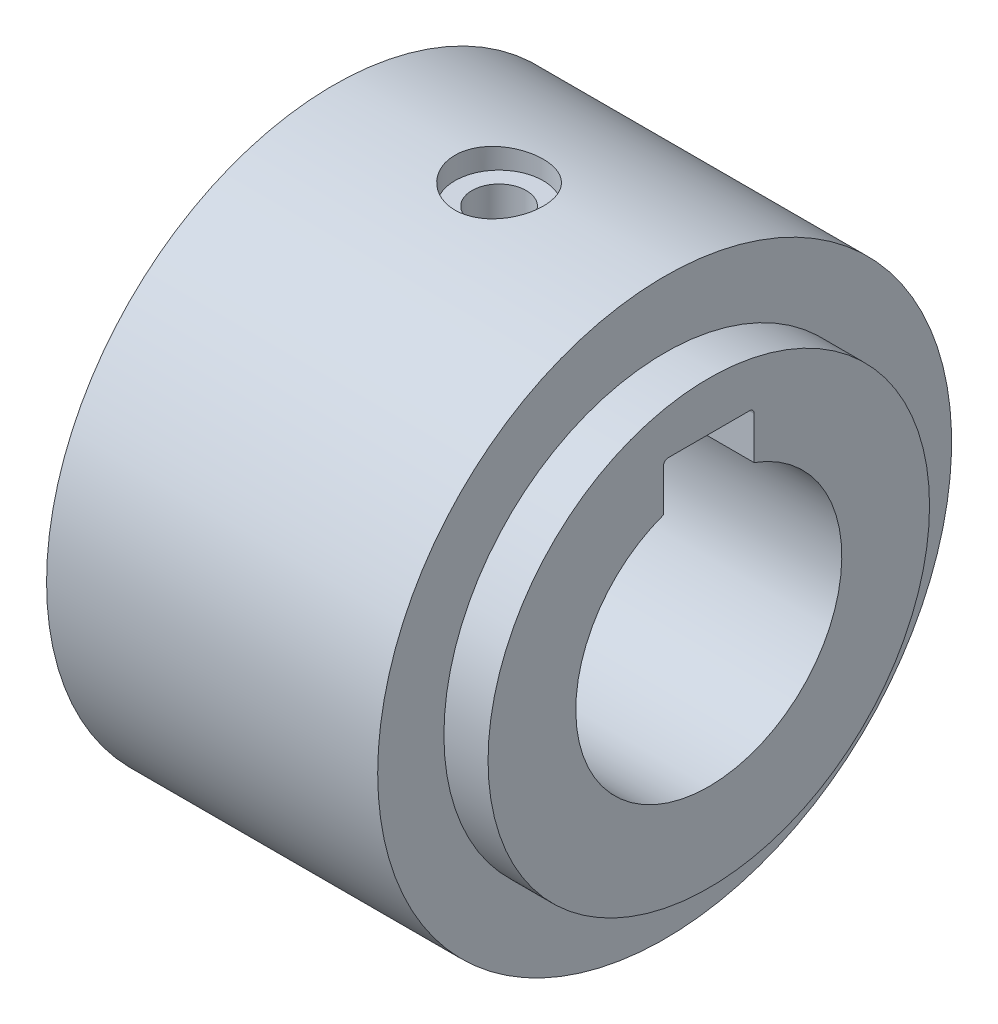
ISO-10303-21;
HEADER;
FILE_DESCRIPTION(('STEP AP214'),'2;1');
FILE_NAME('part.step','',(''),(''),'','','');
FILE_SCHEMA(('AUTOMOTIVE_DESIGN { 1 0 10303 214 1 1 1 1 }'));
ENDSEC;
DATA;
#1=APPLICATION_CONTEXT('core data for automotive mechanical design processes');
#2=APPLICATION_PROTOCOL_DEFINITION('international standard','automotive_design',2000,#1);
#3=PRODUCT_CONTEXT('',#1,'mechanical');
#4=PRODUCT('Part','Part','',(#3));
#5=PRODUCT_RELATED_PRODUCT_CATEGORY('part','',(#4));
#6=PRODUCT_DEFINITION_FORMATION('','',#4);
#7=PRODUCT_DEFINITION_CONTEXT('part definition',#1,'design');
#8=PRODUCT_DEFINITION('design','',#6,#7);
#9=PRODUCT_DEFINITION_SHAPE('','',#8);
#10=(LENGTH_UNIT() NAMED_UNIT(*) SI_UNIT(.MILLI.,.METRE.));
#11=(NAMED_UNIT(*) PLANE_ANGLE_UNIT() SI_UNIT($,.RADIAN.));
#12=(NAMED_UNIT(*) SI_UNIT($,.STERADIAN.) SOLID_ANGLE_UNIT());
#13=UNCERTAINTY_MEASURE_WITH_UNIT(LENGTH_MEASURE(1.E-05),#10,'distance_accuracy_value','');
#14=(GEOMETRIC_REPRESENTATION_CONTEXT(3) GLOBAL_UNCERTAINTY_ASSIGNED_CONTEXT((#13)) GLOBAL_UNIT_ASSIGNED_CONTEXT((#10,
#11,#12)) REPRESENTATION_CONTEXT('',''));
#15=CARTESIAN_POINT('',(0.,0.,0.));
#16=DIRECTION('',(0.,0.,1.));
#17=DIRECTION('',(1.,0.,0.));
#18=AXIS2_PLACEMENT_3D('',#15,#16,#17);
#19=CARTESIAN_POINT('',(9.5,0.,0.));
#20=DIRECTION('',(-1.,0.,0.));
#21=DIRECTION('',(0.,0.,1.));
#22=AXIS2_PLACEMENT_3D('',#19,#20,#21);
#23=CYLINDRICAL_SURFACE('',#22,10.);
#24=CARTESIAN_POINT('',(9.5,0.,0.));
#25=DIRECTION('',(-1.,0.,0.));
#26=DIRECTION('',(0.,0.,1.));
#27=AXIS2_PLACEMENT_3D('',#24,#25,#26);
#28=CIRCLE('',#27,10.);
#29=CARTESIAN_POINT('',(9.5,0.,10.));
#30=VERTEX_POINT('',#29);
#31=EDGE_CURVE('E141',#30,#30,#28,.T.);
#32=ORIENTED_EDGE('',*,*,#31,.T.);
#33=EDGE_LOOP('',(#32));
#34=FACE_BOUND('',#33,.T.);
#35=CARTESIAN_POINT('',(7.5,0.,0.));
#36=DIRECTION('',(-1.,0.,0.));
#37=DIRECTION('',(0.,0.,1.));
#38=AXIS2_PLACEMENT_3D('',#35,#36,#37);
#39=CIRCLE('',#38,10.);
#40=CARTESIAN_POINT('',(7.5,0.,10.));
#41=VERTEX_POINT('',#40);
#42=EDGE_CURVE('E123',#41,#41,#39,.T.);
#43=ORIENTED_EDGE('',*,*,#42,.F.);
#44=EDGE_LOOP('',(#43));
#45=FACE_BOUND('',#44,.T.);
#46=ADVANCED_FACE('F32',(#34,#45),#23,.T.);
#47=CARTESIAN_POINT('',(9.5,10.,0.));
#48=DIRECTION('',(1.,0.,0.));
#49=DIRECTION('',(0.,0.,-1.));
#50=AXIS2_PLACEMENT_3D('',#47,#48,#49);
#51=PLANE('',#50);
#52=CARTESIAN_POINT('',(9.5,0.,0.));
#53=DIRECTION('',(-1.,0.,0.));
#54=DIRECTION('',(0.,0.,1.));
#55=AXIS2_PLACEMENT_3D('',#52,#53,#54);
#56=CIRCLE('',#55,6.025);
#57=CARTESIAN_POINT('',(9.5,5.66552071746278,-2.05));
#58=VERTEX_POINT('',#57);
#59=CARTESIAN_POINT('',(9.5,5.66552071746278,2.05));
#60=VERTEX_POINT('',#59);
#61=EDGE_CURVE('E103',#58,#60,#56,.T.);
#62=ORIENTED_EDGE('',*,*,#61,.T.);
#63=DIRECTION('',(0.,1.,0.));
#64=VECTOR('',#63,1.);
#65=CARTESIAN_POINT('',(9.5,5.63892720293497,2.05));
#66=LINE('',#65,#64);
#67=CARTESIAN_POINT('',(9.5,7.6,2.05));
#68=VERTEX_POINT('',#67);
#69=EDGE_CURVE('E94',#60,#68,#66,.T.);
#70=ORIENTED_EDGE('',*,*,#69,.T.);
#71=CARTESIAN_POINT('',(9.5,7.6,1.85));
#72=DIRECTION('',(1.,0.,0.));
#73=DIRECTION('',(0.,0.,-1.));
#74=AXIS2_PLACEMENT_3D('',#71,#72,#73);
#75=CIRCLE('',#74,0.199999999999999);
#76=CARTESIAN_POINT('',(9.5,7.8,1.85));
#77=VERTEX_POINT('',#76);
#78=EDGE_CURVE('E11',#68,#77,#75,.F.);
#79=ORIENTED_EDGE('',*,*,#78,.T.);
#80=DIRECTION('',(0.,0.,-1.));
#81=VECTOR('',#80,1.);
#82=CARTESIAN_POINT('',(9.5,7.8,2.05));
#83=LINE('',#82,#81);
#84=CARTESIAN_POINT('',(9.5,7.8,-1.85));
#85=VERTEX_POINT('',#84);
#86=EDGE_CURVE('E118',#77,#85,#83,.T.);
#87=ORIENTED_EDGE('',*,*,#86,.T.);
#88=CARTESIAN_POINT('',(9.5,7.6,-1.85));
#89=DIRECTION('',(1.,0.,0.));
#90=DIRECTION('',(0.,0.,-1.));
#91=AXIS2_PLACEMENT_3D('',#88,#89,#90);
#92=CIRCLE('',#91,0.199999999999999);
#93=CARTESIAN_POINT('',(9.5,7.6,-2.05));
#94=VERTEX_POINT('',#93);
#95=EDGE_CURVE('E207',#85,#94,#92,.F.);
#96=ORIENTED_EDGE('',*,*,#95,.T.);
#97=DIRECTION('',(0.,-1.,0.));
#98=VECTOR('',#97,1.);
#99=CARTESIAN_POINT('',(9.5,7.8,-2.05));
#100=LINE('',#99,#98);
#101=EDGE_CURVE('E121',#94,#58,#100,.T.);
#102=ORIENTED_EDGE('',*,*,#101,.T.);
#103=EDGE_LOOP('',(#62,#70,#79,#87,#96,#102));
#104=FACE_BOUND('',#103,.T.);
#105=ORIENTED_EDGE('',*,*,#31,.F.);
#106=EDGE_LOOP('',(#105));
#107=FACE_BOUND('',#106,.T.);
#108=ADVANCED_FACE('F189',(#104,#107),#51,.T.);
#109=CARTESIAN_POINT('',(-9.5,0.,0.));
#110=DIRECTION('',(-1.,0.,0.));
#111=DIRECTION('',(0.,0.,1.));
#112=AXIS2_PLACEMENT_3D('',#109,#110,#111);
#113=PLANE('',#112);
#114=CARTESIAN_POINT('',(-9.5,0.,0.));
#115=DIRECTION('',(-1.,0.,0.));
#116=DIRECTION('',(0.,0.,1.));
#117=AXIS2_PLACEMENT_3D('',#114,#115,#116);
#118=CIRCLE('',#117,6.025);
#119=CARTESIAN_POINT('',(-9.5,5.66552071746278,-2.05));
#120=VERTEX_POINT('',#119);
#121=CARTESIAN_POINT('',(-9.5,5.66552071746278,2.05));
#122=VERTEX_POINT('',#121);
#123=EDGE_CURVE('E100',#120,#122,#118,.T.);
#124=ORIENTED_EDGE('',*,*,#123,.F.);
#125=DIRECTION('',(0.,-1.,0.));
#126=VECTOR('',#125,1.);
#127=CARTESIAN_POINT('',(-9.5,7.8,-2.05));
#128=LINE('',#127,#126);
#129=CARTESIAN_POINT('',(-9.5,7.6,-2.05));
#130=VERTEX_POINT('',#129);
#131=EDGE_CURVE('E86',#130,#120,#128,.T.);
#132=ORIENTED_EDGE('',*,*,#131,.F.);
#133=CARTESIAN_POINT('',(-9.5,7.6,-1.85));
#134=DIRECTION('',(-1.,0.,0.));
#135=DIRECTION('',(0.,0.,1.));
#136=AXIS2_PLACEMENT_3D('',#133,#134,#135);
#137=CIRCLE('',#136,0.199999999999999);
#138=CARTESIAN_POINT('',(-9.5,7.8,-1.85));
#139=VERTEX_POINT('',#138);
#140=EDGE_CURVE('E209',#130,#139,#137,.F.);
#141=ORIENTED_EDGE('',*,*,#140,.T.);
#142=DIRECTION('',(0.,0.,-1.));
#143=VECTOR('',#142,1.);
#144=CARTESIAN_POINT('',(-9.5,7.8,2.05));
#145=LINE('',#144,#143);
#146=CARTESIAN_POINT('',(-9.5,7.8,1.85));
#147=VERTEX_POINT('',#146);
#148=EDGE_CURVE('E95',#147,#139,#145,.T.);
#149=ORIENTED_EDGE('',*,*,#148,.F.);
#150=CARTESIAN_POINT('',(-9.5,7.6,1.85));
#151=DIRECTION('',(-1.,0.,0.));
#152=DIRECTION('',(0.,0.,1.));
#153=AXIS2_PLACEMENT_3D('',#150,#151,#152);
#154=CIRCLE('',#153,0.199999999999999);
#155=CARTESIAN_POINT('',(-9.5,7.6,2.05));
#156=VERTEX_POINT('',#155);
#157=EDGE_CURVE('E40',#147,#156,#154,.F.);
#158=ORIENTED_EDGE('',*,*,#157,.T.);
#159=DIRECTION('',(0.,1.,0.));
#160=VECTOR('',#159,1.);
#161=CARTESIAN_POINT('',(-9.5,5.63892720293497,2.05));
#162=LINE('',#161,#160);
#163=EDGE_CURVE('E104',#122,#156,#162,.T.);
#164=ORIENTED_EDGE('',*,*,#163,.F.);
#165=EDGE_LOOP('',(#124,#132,#141,#149,#158,#164));
#166=FACE_BOUND('',#165,.T.);
#167=CARTESIAN_POINT('',(-9.5,0.,0.));
#168=DIRECTION('',(-1.,0.,0.));
#169=DIRECTION('',(0.,0.,1.));
#170=AXIS2_PLACEMENT_3D('',#167,#168,#169);
#171=CIRCLE('',#170,10.);
#172=CARTESIAN_POINT('',(-9.5,0.,10.));
#173=VERTEX_POINT('',#172);
#174=EDGE_CURVE('E138',#173,#173,#171,.T.);
#175=ORIENTED_EDGE('',*,*,#174,.T.);
#176=EDGE_LOOP('',(#175));
#177=FACE_BOUND('',#176,.T.);
#178=ADVANCED_FACE('F106',(#166,#177),#113,.T.);
#179=CARTESIAN_POINT('',(9.5,0.,0.));
#180=DIRECTION('',(-1.,0.,0.));
#181=DIRECTION('',(0.,0.,1.));
#182=AXIS2_PLACEMENT_3D('',#179,#180,#181);
#183=CYLINDRICAL_SURFACE('',#182,10.);
#184=CARTESIAN_POINT('',(-7.5,0.,0.));
#185=DIRECTION('',(-1.,0.,0.));
#186=DIRECTION('',(0.,0.,1.));
#187=AXIS2_PLACEMENT_3D('',#184,#185,#186);
#188=CIRCLE('',#187,10.);
#189=CARTESIAN_POINT('',(-7.5,0.,10.));
#190=VERTEX_POINT('',#189);
#191=EDGE_CURVE('E135',#190,#190,#188,.T.);
#192=ORIENTED_EDGE('',*,*,#191,.T.);
#193=EDGE_LOOP('',(#192));
#194=FACE_BOUND('',#193,.T.);
#195=ORIENTED_EDGE('',*,*,#174,.F.);
#196=EDGE_LOOP('',(#195));
#197=FACE_BOUND('',#196,.T.);
#198=ADVANCED_FACE('F258',(#194,#197),#183,.T.);
#199=CARTESIAN_POINT('',(-7.5,10.,0.));
#200=DIRECTION('',(-1.,0.,0.));
#201=DIRECTION('',(0.,0.,1.));
#202=AXIS2_PLACEMENT_3D('',#199,#200,#201);
#203=PLANE('',#202);
#204=CARTESIAN_POINT('',(-7.5,0.,0.));
#205=DIRECTION('',(-1.,0.,0.));
#206=DIRECTION('',(0.,0.,1.));
#207=AXIS2_PLACEMENT_3D('',#204,#205,#206);
#208=CIRCLE('',#207,13.);
#209=CARTESIAN_POINT('',(-7.5,0.,13.));
#210=VERTEX_POINT('',#209);
#211=EDGE_CURVE('E132',#210,#210,#208,.T.);
#212=ORIENTED_EDGE('',*,*,#211,.T.);
#213=EDGE_LOOP('',(#212));
#214=FACE_BOUND('',#213,.T.);
#215=ORIENTED_EDGE('',*,*,#191,.F.);
#216=EDGE_LOOP('',(#215));
#217=FACE_BOUND('',#216,.T.);
#218=ADVANCED_FACE('F185',(#214,#217),#203,.T.);
#219=CARTESIAN_POINT('',(9.5,0.,0.));
#220=DIRECTION('',(-1.,0.,0.));
#221=DIRECTION('',(0.,0.,1.));
#222=AXIS2_PLACEMENT_3D('',#219,#220,#221);
#223=CYLINDRICAL_SURFACE('',#222,13.);
#224=CARTESIAN_POINT('',(0.,12.8452325786651,1.99999999999999));
#225=CARTESIAN_POINT('',(0.111625316277804,12.8452344810903,1.9999954155028));
#226=CARTESIAN_POINT('',(0.22331457987838,12.8467033675426,1.99062322989119));
#227=CARTESIAN_POINT('',(0.443567938013635,12.8524159214752,1.95339347168526));
#228=CARTESIAN_POINT('',(0.552128915872479,12.8566622626623,1.92551808666861));
#229=CARTESIAN_POINT('',(0.762905833647189,12.8674376514805,1.85213775006505));
#230=CARTESIAN_POINT('',(0.865126666486456,12.8739649123685,1.8066465946662));
#231=CARTESIAN_POINT('',(1.06047065173473,12.8885645643303,1.6993589625846));
#232=CARTESIAN_POINT('',(1.15359500348066,12.896636751295,1.63756463940024));
#233=CARTESIAN_POINT('',(1.3288999663165,12.9134926681997,1.49886954845251));
#234=CARTESIAN_POINT('',(1.41099291980939,12.922281296972,1.42185856625913));
#235=CARTESIAN_POINT('',(1.56114475320269,12.9395361634044,1.2551542564136));
#236=CARTESIAN_POINT('',(1.62920284841147,12.948002383017,1.16546022012181));
#237=CARTESIAN_POINT('',(1.74967774636576,12.9637099080407,0.975372850066988));
#238=CARTESIAN_POINT('',(1.80201363128909,12.9709447961843,0.874927656151331));
#239=CARTESIAN_POINT('',(1.88903902405367,12.9833201656374,0.666542517316992));
#240=CARTESIAN_POINT('',(1.92372951174587,12.98846076324,0.558602988937953));
#241=CARTESIAN_POINT('',(1.97421310353549,12.9960337802372,0.339196634271207));
#242=CARTESIAN_POINT('',(1.99015311383392,12.9984872421914,0.227764347964194));
#243=CARTESIAN_POINT('',(2.00313957339498,13.0004817082543,0.00378157467292808));
#244=CARTESIAN_POINT('',(2.00018712488629,13.0000228822726,-0.10876884669428));
#245=CARTESIAN_POINT('',(1.97558810574168,12.9962612482755,-0.33079023675238));
#246=CARTESIAN_POINT('',(1.95409959459176,12.9929824869212,-0.440279183105017));
#247=CARTESIAN_POINT('',(1.8932867069432,12.983976175614,-0.654078458079956));
#248=CARTESIAN_POINT('',(1.85396185217065,12.9782485599963,-0.758388647752899));
#249=CARTESIAN_POINT('',(1.75843180681896,12.9649468483415,-0.959345979995526));
#250=CARTESIAN_POINT('',(1.70216038992299,12.9573655304009,-1.05596114275492));
#251=CARTESIAN_POINT('',(1.57438294762323,12.9412007667622,-1.23843720047884));
#252=CARTESIAN_POINT('',(1.50287586816189,12.9326172517469,-1.32429735072024));
#253=CARTESIAN_POINT('',(1.34577725875099,12.915299962037,-1.48375832336462));
#254=CARTESIAN_POINT('',(1.2600476953434,12.9065655514674,-1.55722315390933));
#255=CARTESIAN_POINT('',(1.07740577110596,12.8900173369198,-1.68874531361845));
#256=CARTESIAN_POINT('',(0.980493334458267,12.8822035391841,-1.74680253831329));
#257=CARTESIAN_POINT('',(0.778091366827701,12.8683813118034,-1.84588167483737));
#258=CARTESIAN_POINT('',(0.672594621854339,12.8623744209571,-1.88688907798484));
#259=CARTESIAN_POINT('',(0.456097993099875,12.8528729440273,-1.95056489324025));
#260=CARTESIAN_POINT('',(0.345098519033142,12.8493781711997,-1.97323466853519));
#261=CARTESIAN_POINT('',(0.121958752519587,12.8453322016998,-1.99940410399481));
#262=CARTESIAN_POINT('',(0.00984161573746453,12.8447513686729,-2.00309678102912));
#263=CARTESIAN_POINT('',(-0.213410024311936,12.8465203033818,-1.99171984843909));
#264=CARTESIAN_POINT('',(-0.324544559591962,12.8488699752861,-1.97665085234751));
#265=CARTESIAN_POINT('',(-0.542074965979859,12.8562079116162,-1.9283422246766));
#266=CARTESIAN_POINT('',(-0.64849281012796,12.8611821405404,-1.89519921724071));
#267=CARTESIAN_POINT('',(-0.854262963084022,12.8731971006298,-1.81178406924013));
#268=CARTESIAN_POINT('',(-0.953614906042617,12.8802379387008,-1.76151104251809));
#269=CARTESIAN_POINT('',(-1.14329688380121,12.8956624004429,-1.64480099787561));
#270=CARTESIAN_POINT('',(-1.23354936956815,12.9040562014683,-1.57823931255489));
#271=CARTESIAN_POINT('',(-1.40167229771321,12.9212103652239,-1.43101421024058));
#272=CARTESIAN_POINT('',(-1.47954200181446,12.9299707497711,-1.35034995303561));
#273=CARTESIAN_POINT('',(-1.62138469866344,12.9469638790917,-1.17635828853488));
#274=CARTESIAN_POINT('',(-1.68522959564374,12.9551913123015,-1.08292585827323));
#275=CARTESIAN_POINT('',(-1.79631683961241,12.9701084079627,-0.886549812869696));
#276=CARTESIAN_POINT('',(-1.84355965982717,12.9767981142437,-0.783606468932989));
#277=CARTESIAN_POINT('',(-1.91989820693061,12.9878627763237,-0.571526395780056));
#278=CARTESIAN_POINT('',(-1.9490633026093,12.9922465705557,-0.462415116634572));
#279=CARTESIAN_POINT('',(-1.98864277010101,12.9982426344727,-0.240771121293667));
#280=CARTESIAN_POINT('',(-1.99905844750952,12.9998550971359,-0.128238643884644));
#281=CARTESIAN_POINT('',(-2.00081028286397,13.000124707314,0.0958123278279501));
#282=CARTESIAN_POINT('',(-1.99234219104864,12.9988121755827,0.207329304309455));
#283=CARTESIAN_POINT('',(-1.95698729364873,12.9934405813291,0.427333299995703));
#284=CARTESIAN_POINT('',(-1.93010055615852,12.9893815289608,0.535820330400719));
#285=CARTESIAN_POINT('',(-1.85874231134248,12.9789709459201,0.746626444901645));
#286=CARTESIAN_POINT('',(-1.81428504926665,12.9726212727246,0.848950448398587));
#287=CARTESIAN_POINT('',(-1.70906880145759,12.9583259209828,1.04471732676651));
#288=CARTESIAN_POINT('',(-1.64830923149268,12.9503801852404,1.13815988318731));
#289=CARTESIAN_POINT('',(-1.51150833546337,12.9336775890076,1.31450277940282));
#290=CARTESIAN_POINT('',(-1.43532272925168,12.924913526128,1.39729052004704));
#291=CARTESIAN_POINT('',(-1.27013591927525,12.9076145442476,1.54897720391158));
#292=CARTESIAN_POINT('',(-1.18113171425706,12.8990796794663,1.61787288545449));
#293=CARTESIAN_POINT('',(-0.992211661874019,12.8831510468064,1.74018891459017));
#294=CARTESIAN_POINT('',(-0.892234203478795,12.8757643501487,1.79351501318928));
#295=CARTESIAN_POINT('',(-0.684673516741259,12.8630514342093,1.88253750041785));
#296=CARTESIAN_POINT('',(-0.577098247464234,12.8577230954835,1.91825203381175));
#297=CARTESIAN_POINT('',(-0.390878045323944,12.8509503481968,1.96300920311728));
#298=CARTESIAN_POINT('',(-0.313378495720643,12.8488176746051,1.97685930159685));
#299=CARTESIAN_POINT('',(-0.157263201748828,12.8459581295057,1.99535625053637));
#300=CARTESIAN_POINT('',(-0.0786474730519654,12.8452312382799,2.00000323008374));
#301=CARTESIAN_POINT('',(0.,12.8452325786651,1.99999999999999));
#302=B_SPLINE_CURVE_WITH_KNOTS('',3,(#224,#225,#226,#227,#228,#229,#230,#231,#232,#233,#234,
#235,#236,#237,#238,#239,#240,#241,#242,#243,#244,#245,#246,#247,#248,#249,#250,#251,#252,#253,
#254,#255,#256,#257,#258,#259,#260,#261,#262,#263,#264,#265,#266,#267,#268,#269,#270,#271,#272,
#273,#274,#275,#276,#277,#278,#279,#280,#281,#282,#283,#284,#285,#286,#287,#288,#289,#290,#291,
#292,#293,#294,#295,#296,#297,#298,#299,#300,#301),.UNSPECIFIED.,.T.,.F.,(4,2,2,2,2,2,2,2,2,2,2,
2,2,2,2,2,2,2,2,2,2,2,2,2,2,2,2,2,2,2,2,2,2,2,2,2,2,2,4),(0.,0.334588454354122,
0.669499474060698,1.00414872940281,1.33875380277123,1.67587766624671,2.01302037327516,
2.35186964899047,2.69070010631137,3.02685783020429,3.36299594207585,3.6962957789452,
4.02960455363527,4.36423316798134,4.69888494065178,5.03699821959484,5.37511379101896,
5.71351649860544,6.05189404761719,6.38682303494391,6.72174106991506,7.05488593061303,
7.38804802792875,7.72384447749066,8.05966094015461,8.39842762674496,8.73718465633018,
9.07463360926142,9.41205906339025,9.74600302211113,10.0799457462362,10.4136182808737,
10.7473027750516,11.0842657680091,11.4213077836735,11.7603496490855,12.0990414743328,
12.334784641144,12.5705245012831),.UNSPECIFIED.);
#303=CARTESIAN_POINT('',(0.,12.8452325786651,1.99999999999999));
#304=VERTEX_POINT('',#303);
#305=EDGE_CURVE('E108',#304,#304,#302,.T.);
#306=ORIENTED_EDGE('',*,*,#305,.F.);
#307=EDGE_LOOP('',(#306));
#308=FACE_BOUND('',#307,.T.);
#309=CARTESIAN_POINT('',(7.5,0.,0.));
#310=DIRECTION('',(-1.,0.,0.));
#311=DIRECTION('',(0.,0.,1.));
#312=AXIS2_PLACEMENT_3D('',#309,#310,#311);
#313=CIRCLE('',#312,13.);
#314=CARTESIAN_POINT('',(7.5,0.,13.));
#315=VERTEX_POINT('',#314);
#316=EDGE_CURVE('E129',#315,#315,#313,.T.);
#317=ORIENTED_EDGE('',*,*,#316,.T.);
#318=EDGE_LOOP('',(#317));
#319=FACE_BOUND('',#318,.T.);
#320=ORIENTED_EDGE('',*,*,#211,.F.);
#321=EDGE_LOOP('',(#320));
#322=FACE_BOUND('',#321,.T.);
#323=ADVANCED_FACE('F151',(#308,#319,#322),#223,.T.);
#324=CARTESIAN_POINT('',(7.5,13.,0.));
#325=DIRECTION('',(1.,0.,0.));
#326=DIRECTION('',(0.,0.,-1.));
#327=AXIS2_PLACEMENT_3D('',#324,#325,#326);
#328=PLANE('',#327);
#329=ORIENTED_EDGE('',*,*,#42,.T.);
#330=EDGE_LOOP('',(#329));
#331=FACE_BOUND('',#330,.T.);
#332=ORIENTED_EDGE('',*,*,#316,.F.);
#333=EDGE_LOOP('',(#332));
#334=FACE_BOUND('',#333,.T.);
#335=ADVANCED_FACE('F175',(#331,#334),#328,.T.);
#336=CARTESIAN_POINT('',(9.5,7.8,-2.05));
#337=DIRECTION('',(0.,0.,-1.));
#338=DIRECTION('',(-1.,0.,0.));
#339=AXIS2_PLACEMENT_3D('',#336,#337,#338);
#340=PLANE('',#339);
#341=ORIENTED_EDGE('',*,*,#101,.F.);
#342=DIRECTION('',(-1.,0.,0.));
#343=VECTOR('',#342,1.);
#344=CARTESIAN_POINT('',(-9.5,7.6,-2.05));
#345=LINE('',#344,#343);
#346=EDGE_CURVE('E92',#94,#130,#345,.T.);
#347=ORIENTED_EDGE('',*,*,#346,.T.);
#348=ORIENTED_EDGE('',*,*,#131,.T.);
#349=DIRECTION('',(-1.,0.,0.));
#350=VECTOR('',#349,1.);
#351=CARTESIAN_POINT('',(9.5,5.66552071746278,-2.05));
#352=LINE('',#351,#350);
#353=EDGE_CURVE('E90',#120,#58,#352,.F.);
#354=ORIENTED_EDGE('',*,*,#353,.T.);
#355=EDGE_LOOP('',(#341,#347,#348,#354));
#356=FACE_BOUND('',#355,.T.);
#357=ADVANCED_FACE('F89',(#356),#340,.F.);
#358=CARTESIAN_POINT('',(9.5,7.8,2.05));
#359=DIRECTION('',(0.,1.,0.));
#360=DIRECTION('',(-1.,0.,0.));
#361=AXIS2_PLACEMENT_3D('',#358,#359,#360);
#362=PLANE('',#361);
#363=CARTESIAN_POINT('',(0.,7.8,0.));
#364=DIRECTION('',(0.,1.,0.));
#365=DIRECTION('',(-1.,0.,0.));
#366=AXIS2_PLACEMENT_3D('',#363,#364,#365);
#367=CIRCLE('',#366,1.2295);
#368=CARTESIAN_POINT('',(-1.2295,7.8,0.));
#369=VERTEX_POINT('',#368);
#370=EDGE_CURVE('E112',#369,#369,#367,.T.);
#371=ORIENTED_EDGE('',*,*,#370,.T.);
#372=EDGE_LOOP('',(#371));
#373=FACE_BOUND('',#372,.T.);
#374=ORIENTED_EDGE('',*,*,#148,.T.);
#375=DIRECTION('',(-1.,0.,0.));
#376=VECTOR('',#375,1.);
#377=CARTESIAN_POINT('',(9.5,7.8,-1.85));
#378=LINE('',#377,#376);
#379=EDGE_CURVE('E208',#139,#85,#378,.F.);
#380=ORIENTED_EDGE('',*,*,#379,.T.);
#381=ORIENTED_EDGE('',*,*,#86,.F.);
#382=DIRECTION('',(-1.,0.,0.));
#383=VECTOR('',#382,1.);
#384=CARTESIAN_POINT('',(-9.5,7.8,1.85));
#385=LINE('',#384,#383);
#386=EDGE_CURVE('E214',#77,#147,#385,.T.);
#387=ORIENTED_EDGE('',*,*,#386,.T.);
#388=EDGE_LOOP('',(#374,#380,#381,#387));
#389=FACE_BOUND('',#388,.T.);
#390=ADVANCED_FACE('F174',(#373,#389),#362,.F.);
#391=CARTESIAN_POINT('',(9.5,5.63892720293497,2.05));
#392=DIRECTION('',(0.,0.,1.));
#393=DIRECTION('',(1.,0.,0.));
#394=AXIS2_PLACEMENT_3D('',#391,#392,#393);
#395=PLANE('',#394);
#396=ORIENTED_EDGE('',*,*,#163,.T.);
#397=DIRECTION('',(-1.,0.,0.));
#398=VECTOR('',#397,1.);
#399=CARTESIAN_POINT('',(9.5,7.6,2.05));
#400=LINE('',#399,#398);
#401=EDGE_CURVE('E53',#156,#68,#400,.F.);
#402=ORIENTED_EDGE('',*,*,#401,.T.);
#403=ORIENTED_EDGE('',*,*,#69,.F.);
#404=DIRECTION('',(-1.,0.,0.));
#405=VECTOR('',#404,1.);
#406=CARTESIAN_POINT('',(9.5,5.66552071746278,2.05));
#407=LINE('',#406,#405);
#408=EDGE_CURVE('E144',#60,#122,#407,.T.);
#409=ORIENTED_EDGE('',*,*,#408,.T.);
#410=EDGE_LOOP('',(#396,#402,#403,#409));
#411=FACE_BOUND('',#410,.T.);
#412=ADVANCED_FACE('F171',(#411),#395,.F.);
#413=CARTESIAN_POINT('',(9.5,0.,0.));
#414=DIRECTION('',(-1.,0.,0.));
#415=DIRECTION('',(0.,0.,1.));
#416=AXIS2_PLACEMENT_3D('',#413,#414,#415);
#417=CYLINDRICAL_SURFACE('',#416,6.025);
#418=ORIENTED_EDGE('',*,*,#123,.T.);
#419=ORIENTED_EDGE('',*,*,#408,.F.);
#420=ORIENTED_EDGE('',*,*,#61,.F.);
#421=ORIENTED_EDGE('',*,*,#353,.F.);
#422=EDGE_LOOP('',(#418,#419,#420,#421));
#423=FACE_BOUND('',#422,.T.);
#424=ADVANCED_FACE('F99',(#423),#417,.F.);
#425=CARTESIAN_POINT('',(0.,35.2639320225002,0.));
#426=DIRECTION('',(0.,1.,0.));
#427=DIRECTION('',(0.,0.,1.));
#428=AXIS2_PLACEMENT_3D('',#425,#426,#427);
#429=CYLINDRICAL_SURFACE('',#428,1.2295);
#430=ORIENTED_EDGE('',*,*,#370,.F.);
#431=EDGE_LOOP('',(#430));
#432=FACE_BOUND('',#431,.T.);
#433=CARTESIAN_POINT('',(0.,12.,0.));
#434=DIRECTION('',(0.,1.,0.));
#435=DIRECTION('',(0.,0.,1.));
#436=AXIS2_PLACEMENT_3D('',#433,#434,#435);
#437=CIRCLE('',#436,1.2295);
#438=CARTESIAN_POINT('',(0.,12.,1.2295));
#439=VERTEX_POINT('',#438);
#440=EDGE_CURVE('E334',#439,#439,#437,.T.);
#441=ORIENTED_EDGE('',*,*,#440,.T.);
#442=EDGE_LOOP('',(#441));
#443=FACE_BOUND('',#442,.T.);
#444=ADVANCED_FACE('F164',(#432,#443),#429,.F.);
#445=CARTESIAN_POINT('',(1.2295,12.,0.));
#446=DIRECTION('',(0.,-1.,0.));
#447=DIRECTION('',(0.,0.,-1.));
#448=AXIS2_PLACEMENT_3D('',#445,#446,#447);
#449=PLANE('',#448);
#450=ORIENTED_EDGE('',*,*,#440,.F.);
#451=EDGE_LOOP('',(#450));
#452=FACE_BOUND('',#451,.T.);
#453=CARTESIAN_POINT('',(0.,12.,0.));
#454=DIRECTION('',(0.,1.,0.));
#455=DIRECTION('',(0.,0.,1.));
#456=AXIS2_PLACEMENT_3D('',#453,#454,#455);
#457=CIRCLE('',#456,1.99999999999999);
#458=CARTESIAN_POINT('',(0.,12.,1.99999999999999));
#459=VERTEX_POINT('',#458);
#460=EDGE_CURVE('E332',#459,#459,#457,.T.);
#461=ORIENTED_EDGE('',*,*,#460,.T.);
#462=EDGE_LOOP('',(#461));
#463=FACE_BOUND('',#462,.T.);
#464=ADVANCED_FACE('F160',(#452,#463),#449,.F.);
#465=CARTESIAN_POINT('',(0.,35.2639320225002,0.));
#466=DIRECTION('',(0.,1.,0.));
#467=DIRECTION('',(0.,0.,1.));
#468=AXIS2_PLACEMENT_3D('',#465,#466,#467);
#469=CYLINDRICAL_SURFACE('',#468,1.99999999999999);
#470=ORIENTED_EDGE('',*,*,#305,.T.);
#471=EDGE_LOOP('',(#470));
#472=FACE_BOUND('',#471,.T.);
#473=ORIENTED_EDGE('',*,*,#460,.F.);
#474=EDGE_LOOP('',(#473));
#475=FACE_BOUND('',#474,.T.);
#476=ADVANCED_FACE('F155',(#472,#475),#469,.F.);
#477=CARTESIAN_POINT('',(9.5,7.6,-1.85));
#478=DIRECTION('',(1.,0.,0.));
#479=DIRECTION('',(0.,1.,0.));
#480=AXIS2_PLACEMENT_3D('',#477,#478,#479);
#481=CYLINDRICAL_SURFACE('',#480,0.199999999999999);
#482=ORIENTED_EDGE('',*,*,#95,.F.);
#483=ORIENTED_EDGE('',*,*,#379,.F.);
#484=ORIENTED_EDGE('',*,*,#140,.F.);
#485=ORIENTED_EDGE('',*,*,#346,.F.);
#486=EDGE_LOOP('',(#482,#483,#484,#485));
#487=FACE_BOUND('',#486,.T.);
#488=ADVANCED_FACE('F159',(#487),#481,.F.);
#489=CARTESIAN_POINT('',(9.5,7.6,1.85));
#490=DIRECTION('',(1.,0.,0.));
#491=DIRECTION('',(0.,1.,0.));
#492=AXIS2_PLACEMENT_3D('',#489,#490,#491);
#493=CYLINDRICAL_SURFACE('',#492,0.199999999999999);
#494=ORIENTED_EDGE('',*,*,#78,.F.);
#495=ORIENTED_EDGE('',*,*,#401,.F.);
#496=ORIENTED_EDGE('',*,*,#157,.F.);
#497=ORIENTED_EDGE('',*,*,#386,.F.);
#498=EDGE_LOOP('',(#494,#495,#496,#497));
#499=FACE_BOUND('',#498,.T.);
#500=ADVANCED_FACE('F34',(#499),#493,.F.);
#501=CLOSED_SHELL('',(#46,#108,#178,#198,#218,#323,#335,#357,#390,#412,#424,#444,#464,#476,#488,#500));
#502=MANIFOLD_SOLID_BREP('B2',#501);
#503=ADVANCED_BREP_SHAPE_REPRESENTATION('',(#18,#502),#14);
#504=SHAPE_DEFINITION_REPRESENTATION(#9,#503);
ENDSEC;
END-ISO-10303-21;
